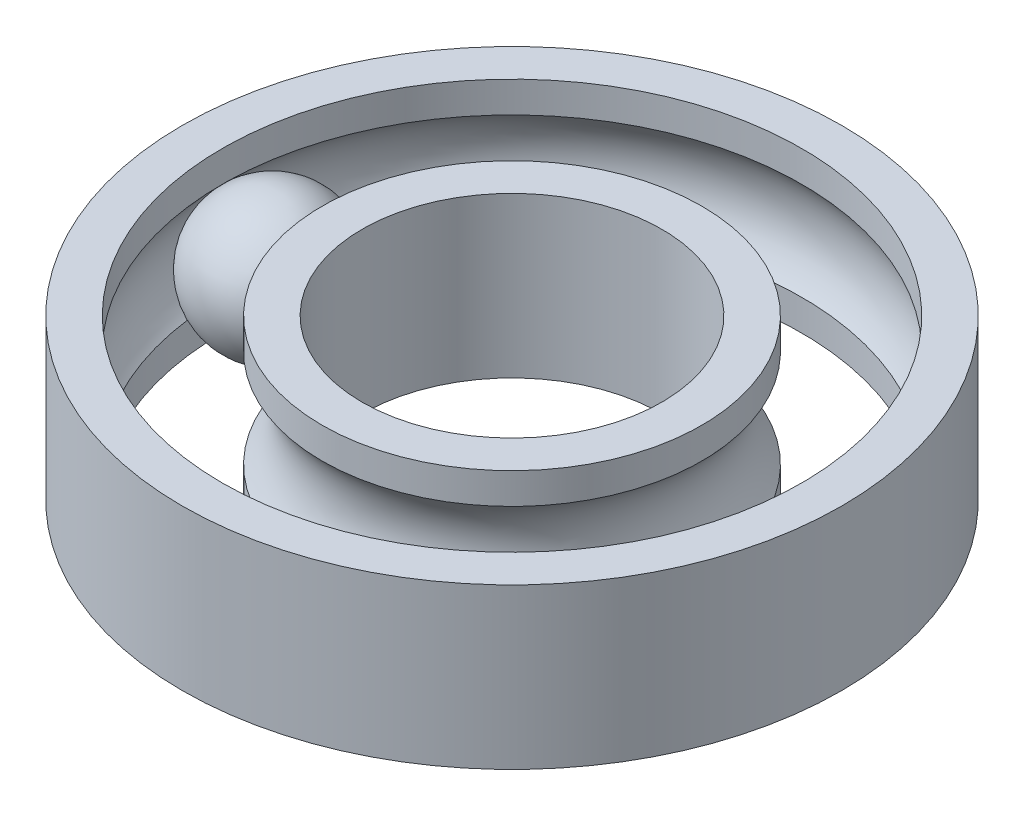
ISO-10303-21;
HEADER;
FILE_DESCRIPTION(('STEP AP214'),'2;1');
FILE_NAME('part.step','',(''),(''),'','','');
FILE_SCHEMA(('AUTOMOTIVE_DESIGN { 1 0 10303 214 1 1 1 1 }'));
ENDSEC;
DATA;
#1=APPLICATION_CONTEXT('core data for automotive mechanical design processes');
#2=APPLICATION_PROTOCOL_DEFINITION('international standard','automotive_design',2000,#1);
#3=PRODUCT_CONTEXT('',#1,'mechanical');
#4=PRODUCT('Part','Part','',(#3));
#5=PRODUCT_RELATED_PRODUCT_CATEGORY('part','',(#4));
#6=PRODUCT_DEFINITION_FORMATION('','',#4);
#7=PRODUCT_DEFINITION_CONTEXT('part definition',#1,'design');
#8=PRODUCT_DEFINITION('design','',#6,#7);
#9=PRODUCT_DEFINITION_SHAPE('','',#8);
#10=(LENGTH_UNIT() NAMED_UNIT(*) SI_UNIT(.MILLI.,.METRE.));
#11=(NAMED_UNIT(*) PLANE_ANGLE_UNIT() SI_UNIT($,.RADIAN.));
#12=(NAMED_UNIT(*) SI_UNIT($,.STERADIAN.) SOLID_ANGLE_UNIT());
#13=UNCERTAINTY_MEASURE_WITH_UNIT(LENGTH_MEASURE(1.E-05),#10,'distance_accuracy_value','');
#14=(GEOMETRIC_REPRESENTATION_CONTEXT(3) GLOBAL_UNCERTAINTY_ASSIGNED_CONTEXT((#13)) GLOBAL_UNIT_ASSIGNED_CONTEXT((#10,
#11,#12)) REPRESENTATION_CONTEXT('',''));
#15=CARTESIAN_POINT('',(0.,0.,0.));
#16=DIRECTION('',(0.,0.,1.));
#17=DIRECTION('',(1.,0.,0.));
#18=AXIS2_PLACEMENT_3D('',#15,#16,#17);
#19=CARTESIAN_POINT('',(0.,11.176000344372,0.));
#20=DIRECTION('',(0.,1.,0.));
#21=DIRECTION('',(0.,0.,1.));
#22=AXIS2_PLACEMENT_3D('',#19,#20,#21);
#23=CYLINDRICAL_SURFACE('',#22,24.13);
#24=CARTESIAN_POINT('',(0.,6.22170411065594,0.));
#25=DIRECTION('',(0.,1.,0.));
#26=DIRECTION('',(0.,0.,1.));
#27=AXIS2_PLACEMENT_3D('',#24,#25,#26);
#28=CIRCLE('',#27,24.13);
#29=CARTESIAN_POINT('',(0.,6.22170411065594,24.13));
#30=VERTEX_POINT('',#29);
#31=EDGE_CURVE('E11',#30,#30,#28,.T.);
#32=ORIENTED_EDGE('',*,*,#31,.T.);
#33=EDGE_LOOP('',(#32));
#34=FACE_BOUND('',#33,.T.);
#35=CARTESIAN_POINT('',(0.,10.16,0.));
#36=DIRECTION('',(0.,1.,0.));
#37=DIRECTION('',(0.,0.,1.));
#38=AXIS2_PLACEMENT_3D('',#35,#36,#37);
#39=CIRCLE('',#38,24.13);
#40=CARTESIAN_POINT('',(0.,10.16,24.13));
#41=VERTEX_POINT('',#40);
#42=EDGE_CURVE('E68',#41,#41,#39,.T.);
#43=ORIENTED_EDGE('',*,*,#42,.F.);
#44=EDGE_LOOP('',(#43));
#45=FACE_BOUND('',#44,.T.);
#46=ADVANCED_FACE('F46',(#34,#45),#23,.T.);
#47=CARTESIAN_POINT('',(0.,1.63986674698843E-07,0.));
#48=DIRECTION('',(0.,1.,0.));
#49=DIRECTION('',(0.,0.,1.));
#50=AXIS2_PLACEMENT_3D('',#47,#48,#49);
#51=TOROIDAL_SURFACE('',#50,30.48,8.88999999999999);
#52=CARTESIAN_POINT('',(0.,-6.22170378268259,0.));
#53=DIRECTION('',(0.,1.,0.));
#54=DIRECTION('',(0.,0.,1.));
#55=AXIS2_PLACEMENT_3D('',#52,#53,#54);
#56=CIRCLE('',#55,24.13);
#57=CARTESIAN_POINT('',(0.,-6.22170378268259,24.13));
#58=VERTEX_POINT('',#57);
#59=EDGE_CURVE('E52',#58,#58,#56,.T.);
#60=ORIENTED_EDGE('',*,*,#59,.T.);
#61=EDGE_LOOP('',(#60));
#62=FACE_BOUND('',#61,.T.);
#63=ORIENTED_EDGE('',*,*,#31,.F.);
#64=EDGE_LOOP('',(#63));
#65=FACE_BOUND('',#64,.T.);
#66=ADVANCED_FACE('F76',(#62,#65),#51,.F.);
#67=CARTESIAN_POINT('',(0.,11.176000344372,0.));
#68=DIRECTION('',(0.,1.,0.));
#69=DIRECTION('',(0.,0.,1.));
#70=AXIS2_PLACEMENT_3D('',#67,#68,#69);
#71=CYLINDRICAL_SURFACE('',#70,24.13);
#72=CARTESIAN_POINT('',(0.,-10.16,0.));
#73=DIRECTION('',(0.,1.,0.));
#74=DIRECTION('',(0.,0.,1.));
#75=AXIS2_PLACEMENT_3D('',#72,#73,#74);
#76=CIRCLE('',#75,24.13);
#77=CARTESIAN_POINT('',(0.,-10.16,24.13));
#78=VERTEX_POINT('',#77);
#79=EDGE_CURVE('E56',#78,#78,#76,.T.);
#80=ORIENTED_EDGE('',*,*,#79,.T.);
#81=EDGE_LOOP('',(#80));
#82=FACE_BOUND('',#81,.T.);
#83=ORIENTED_EDGE('',*,*,#59,.F.);
#84=EDGE_LOOP('',(#83));
#85=FACE_BOUND('',#84,.T.);
#86=ADVANCED_FACE('F80',(#82,#85),#71,.T.);
#87=CARTESIAN_POINT('',(-19.05,-10.16,0.));
#88=DIRECTION('',(0.,-1.,0.));
#89=DIRECTION('',(0.,0.,-1.));
#90=AXIS2_PLACEMENT_3D('',#87,#88,#89);
#91=PLANE('',#90);
#92=CARTESIAN_POINT('',(0.,-10.16,0.));
#93=DIRECTION('',(0.,1.,0.));
#94=DIRECTION('',(0.,0.,1.));
#95=AXIS2_PLACEMENT_3D('',#92,#93,#94);
#96=CIRCLE('',#95,19.05);
#97=CARTESIAN_POINT('',(0.,-10.16,19.05));
#98=VERTEX_POINT('',#97);
#99=EDGE_CURVE('E60',#98,#98,#96,.T.);
#100=ORIENTED_EDGE('',*,*,#99,.T.);
#101=EDGE_LOOP('',(#100));
#102=FACE_BOUND('',#101,.T.);
#103=ORIENTED_EDGE('',*,*,#79,.F.);
#104=EDGE_LOOP('',(#103));
#105=FACE_BOUND('',#104,.T.);
#106=ADVANCED_FACE('F84',(#102,#105),#91,.T.);
#107=CARTESIAN_POINT('',(0.,11.176000344372,0.));
#108=DIRECTION('',(0.,1.,0.));
#109=DIRECTION('',(0.,0.,1.));
#110=AXIS2_PLACEMENT_3D('',#107,#108,#109);
#111=CYLINDRICAL_SURFACE('',#110,19.05);
#112=CARTESIAN_POINT('',(0.,10.16,0.));
#113=DIRECTION('',(0.,1.,0.));
#114=DIRECTION('',(0.,0.,1.));
#115=AXIS2_PLACEMENT_3D('',#112,#113,#114);
#116=CIRCLE('',#115,19.05);
#117=CARTESIAN_POINT('',(0.,10.16,19.05));
#118=VERTEX_POINT('',#117);
#119=EDGE_CURVE('E65',#118,#118,#116,.T.);
#120=ORIENTED_EDGE('',*,*,#119,.T.);
#121=EDGE_LOOP('',(#120));
#122=FACE_BOUND('',#121,.T.);
#123=ORIENTED_EDGE('',*,*,#99,.F.);
#124=EDGE_LOOP('',(#123));
#125=FACE_BOUND('',#124,.T.);
#126=ADVANCED_FACE('F91',(#122,#125),#111,.F.);
#127=CARTESIAN_POINT('',(-19.05,10.16,0.));
#128=DIRECTION('',(0.,1.,0.));
#129=DIRECTION('',(0.,0.,1.));
#130=AXIS2_PLACEMENT_3D('',#127,#128,#129);
#131=PLANE('',#130);
#132=ORIENTED_EDGE('',*,*,#42,.T.);
#133=EDGE_LOOP('',(#132));
#134=FACE_BOUND('',#133,.T.);
#135=ORIENTED_EDGE('',*,*,#119,.F.);
#136=EDGE_LOOP('',(#135));
#137=FACE_BOUND('',#136,.T.);
#138=ADVANCED_FACE('F72',(#134,#137),#131,.T.);
#139=CLOSED_SHELL('',(#46,#66,#86,#106,#126,#138));
#140=MANIFOLD_SOLID_BREP('B2',#139);
#141=CARTESIAN_POINT('',(0.,11.176000344372,0.));
#142=DIRECTION('',(0.,1.,0.));
#143=DIRECTION('',(0.,0.,1.));
#144=AXIS2_PLACEMENT_3D('',#141,#142,#143);
#145=CYLINDRICAL_SURFACE('',#144,36.83);
#146=CARTESIAN_POINT('',(0.,10.1600003279733,0.));
#147=DIRECTION('',(0.,1.,0.));
#148=DIRECTION('',(0.,0.,1.));
#149=AXIS2_PLACEMENT_3D('',#146,#147,#148);
#150=CIRCLE('',#149,36.83);
#151=CARTESIAN_POINT('',(0.,10.1600003279733,36.83));
#152=VERTEX_POINT('',#151);
#153=EDGE_CURVE('E45',#152,#152,#150,.T.);
#154=ORIENTED_EDGE('',*,*,#153,.T.);
#155=EDGE_LOOP('',(#154));
#156=FACE_BOUND('',#155,.T.);
#157=CARTESIAN_POINT('',(0.,6.22170411065594,0.));
#158=DIRECTION('',(0.,1.,0.));
#159=DIRECTION('',(0.,0.,1.));
#160=AXIS2_PLACEMENT_3D('',#157,#158,#159);
#161=CIRCLE('',#160,36.83);
#162=CARTESIAN_POINT('',(0.,6.22170411065594,36.83));
#163=VERTEX_POINT('',#162);
#164=EDGE_CURVE('E165',#163,#163,#161,.T.);
#165=ORIENTED_EDGE('',*,*,#164,.F.);
#166=EDGE_LOOP('',(#165));
#167=FACE_BOUND('',#166,.T.);
#168=ADVANCED_FACE('F143',(#156,#167),#145,.F.);
#169=CARTESIAN_POINT('',(-41.91,10.1600003279733,0.));
#170=DIRECTION('',(0.,1.,0.));
#171=DIRECTION('',(0.,0.,1.));
#172=AXIS2_PLACEMENT_3D('',#169,#170,#171);
#173=PLANE('',#172);
#174=CARTESIAN_POINT('',(0.,10.1600003279733,0.));
#175=DIRECTION('',(0.,1.,0.));
#176=DIRECTION('',(0.,0.,1.));
#177=AXIS2_PLACEMENT_3D('',#174,#175,#176);
#178=CIRCLE('',#177,41.91);
#179=CARTESIAN_POINT('',(0.,10.1600003279733,41.91));
#180=VERTEX_POINT('',#179);
#181=EDGE_CURVE('E149',#180,#180,#178,.T.);
#182=ORIENTED_EDGE('',*,*,#181,.T.);
#183=EDGE_LOOP('',(#182));
#184=FACE_BOUND('',#183,.T.);
#185=ORIENTED_EDGE('',*,*,#153,.F.);
#186=EDGE_LOOP('',(#185));
#187=FACE_BOUND('',#186,.T.);
#188=ADVANCED_FACE('F173',(#184,#187),#173,.T.);
#189=CARTESIAN_POINT('',(0.,11.176000344372,0.));
#190=DIRECTION('',(0.,1.,0.));
#191=DIRECTION('',(0.,0.,1.));
#192=AXIS2_PLACEMENT_3D('',#189,#190,#191);
#193=CYLINDRICAL_SURFACE('',#192,41.91);
#194=CARTESIAN_POINT('',(0.,-10.1599996720267,0.));
#195=DIRECTION('',(0.,1.,0.));
#196=DIRECTION('',(0.,0.,1.));
#197=AXIS2_PLACEMENT_3D('',#194,#195,#196);
#198=CIRCLE('',#197,41.91);
#199=CARTESIAN_POINT('',(0.,-10.1599996720267,41.91));
#200=VERTEX_POINT('',#199);
#201=EDGE_CURVE('E153',#200,#200,#198,.T.);
#202=ORIENTED_EDGE('',*,*,#201,.T.);
#203=EDGE_LOOP('',(#202));
#204=FACE_BOUND('',#203,.T.);
#205=ORIENTED_EDGE('',*,*,#181,.F.);
#206=EDGE_LOOP('',(#205));
#207=FACE_BOUND('',#206,.T.);
#208=ADVANCED_FACE('F177',(#204,#207),#193,.T.);
#209=CARTESIAN_POINT('',(-41.91,-10.1599996720267,0.));
#210=DIRECTION('',(0.,-1.,0.));
#211=DIRECTION('',(0.,0.,-1.));
#212=AXIS2_PLACEMENT_3D('',#209,#210,#211);
#213=PLANE('',#212);
#214=CARTESIAN_POINT('',(0.,-10.1599996720267,0.));
#215=DIRECTION('',(0.,1.,0.));
#216=DIRECTION('',(0.,0.,1.));
#217=AXIS2_PLACEMENT_3D('',#214,#215,#216);
#218=CIRCLE('',#217,36.83);
#219=CARTESIAN_POINT('',(0.,-10.1599996720267,36.83));
#220=VERTEX_POINT('',#219);
#221=EDGE_CURVE('E157',#220,#220,#218,.T.);
#222=ORIENTED_EDGE('',*,*,#221,.T.);
#223=EDGE_LOOP('',(#222));
#224=FACE_BOUND('',#223,.T.);
#225=ORIENTED_EDGE('',*,*,#201,.F.);
#226=EDGE_LOOP('',(#225));
#227=FACE_BOUND('',#226,.T.);
#228=ADVANCED_FACE('F181',(#224,#227),#213,.T.);
#229=CARTESIAN_POINT('',(0.,11.176000344372,0.));
#230=DIRECTION('',(0.,1.,0.));
#231=DIRECTION('',(0.,0.,1.));
#232=AXIS2_PLACEMENT_3D('',#229,#230,#231);
#233=CYLINDRICAL_SURFACE('',#232,36.83);
#234=CARTESIAN_POINT('',(0.,-6.22170378268259,0.));
#235=DIRECTION('',(0.,1.,0.));
#236=DIRECTION('',(0.,0.,1.));
#237=AXIS2_PLACEMENT_3D('',#234,#235,#236);
#238=CIRCLE('',#237,36.83);
#239=CARTESIAN_POINT('',(0.,-6.22170378268259,36.83));
#240=VERTEX_POINT('',#239);
#241=EDGE_CURVE('E162',#240,#240,#238,.T.);
#242=ORIENTED_EDGE('',*,*,#241,.T.);
#243=EDGE_LOOP('',(#242));
#244=FACE_BOUND('',#243,.T.);
#245=ORIENTED_EDGE('',*,*,#221,.F.);
#246=EDGE_LOOP('',(#245));
#247=FACE_BOUND('',#246,.T.);
#248=ADVANCED_FACE('F188',(#244,#247),#233,.F.);
#249=CARTESIAN_POINT('',(0.,1.63986674698843E-07,0.));
#250=DIRECTION('',(0.,1.,0.));
#251=DIRECTION('',(0.,0.,1.));
#252=AXIS2_PLACEMENT_3D('',#249,#250,#251);
#253=TOROIDAL_SURFACE('',#252,30.48,8.88999999999999);
#254=ORIENTED_EDGE('',*,*,#164,.T.);
#255=EDGE_LOOP('',(#254));
#256=FACE_BOUND('',#255,.T.);
#257=ORIENTED_EDGE('',*,*,#241,.F.);
#258=EDGE_LOOP('',(#257));
#259=FACE_BOUND('',#258,.T.);
#260=ADVANCED_FACE('F169',(#256,#259),#253,.F.);
#261=CLOSED_SHELL('',(#168,#188,#208,#228,#248,#260));
#262=MANIFOLD_SOLID_BREP('B6',#261);
#263=CARTESIAN_POINT('',(-30.48,1.63986674933669E-07,0.));
#264=DIRECTION('',(0.,1.,0.));
#265=DIRECTION('',(1.,0.,0.));
#266=AXIS2_PLACEMENT_3D('',#263,#264,#265);
#267=SPHERICAL_SURFACE('',#266,8.88999999999999);
#268=CARTESIAN_POINT('',(-30.48,8.89000016398667,0.));
#269=VERTEX_POINT('',#268);
#270=VERTEX_LOOP('',#269);
#271=FACE_BOUND('',#270,.T.);
#272=ADVANCED_FACE('F235',(#271),#267,.T.);
#273=CLOSED_SHELL('',(#272));
#274=MANIFOLD_SOLID_BREP('B40',#273);
#275=ADVANCED_BREP_SHAPE_REPRESENTATION('',(#18,#140,#262,#274),#14);
#276=SHAPE_DEFINITION_REPRESENTATION(#9,#275);
ENDSEC;
END-ISO-10303-21;
